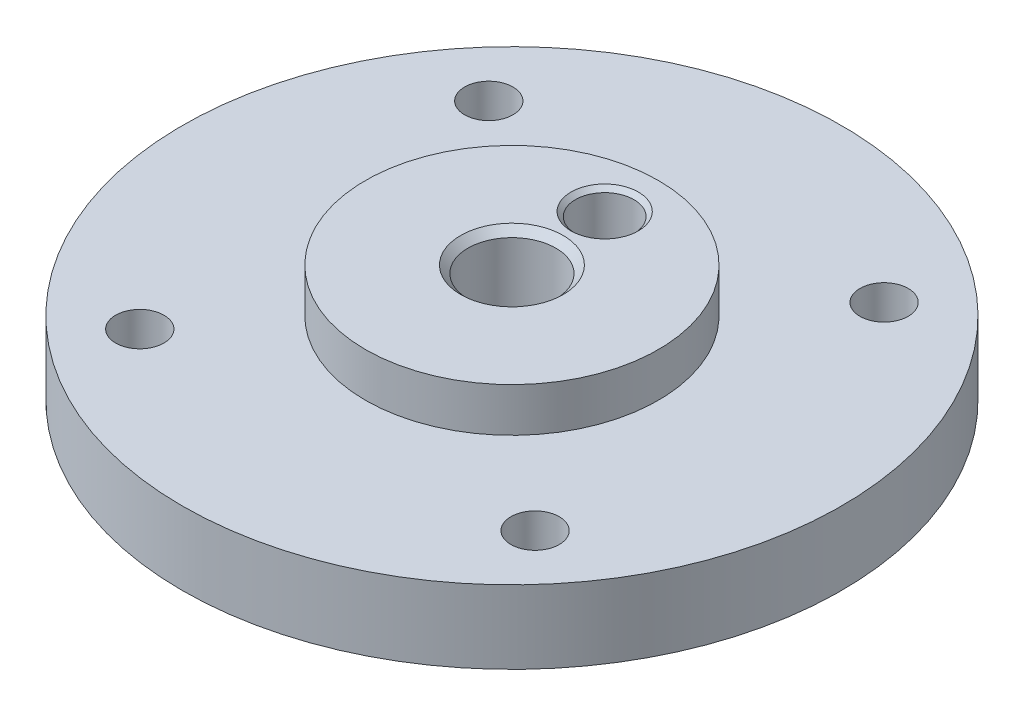
ISO-10303-21;
HEADER;
FILE_DESCRIPTION(('STEP AP214'),'2;1');
FILE_NAME('part.step','',(''),(''),'','','');
FILE_SCHEMA(('AUTOMOTIVE_DESIGN { 1 0 10303 214 1 1 1 1 }'));
ENDSEC;
DATA;
#1=APPLICATION_CONTEXT('core data for automotive mechanical design processes');
#2=APPLICATION_PROTOCOL_DEFINITION('international standard','automotive_design',2000,#1);
#3=PRODUCT_CONTEXT('',#1,'mechanical');
#4=PRODUCT('Part','Part','',(#3));
#5=PRODUCT_RELATED_PRODUCT_CATEGORY('part','',(#4));
#6=PRODUCT_DEFINITION_FORMATION('','',#4);
#7=PRODUCT_DEFINITION_CONTEXT('part definition',#1,'design');
#8=PRODUCT_DEFINITION('design','',#6,#7);
#9=PRODUCT_DEFINITION_SHAPE('','',#8);
#10=(LENGTH_UNIT() NAMED_UNIT(*) SI_UNIT(.MILLI.,.METRE.));
#11=(NAMED_UNIT(*) PLANE_ANGLE_UNIT() SI_UNIT($,.RADIAN.));
#12=(NAMED_UNIT(*) SI_UNIT($,.STERADIAN.) SOLID_ANGLE_UNIT());
#13=UNCERTAINTY_MEASURE_WITH_UNIT(LENGTH_MEASURE(1.E-05),#10,'distance_accuracy_value','');
#14=(GEOMETRIC_REPRESENTATION_CONTEXT(3) GLOBAL_UNCERTAINTY_ASSIGNED_CONTEXT((#13)) GLOBAL_UNIT_ASSIGNED_CONTEXT((#10,
#11,#12)) REPRESENTATION_CONTEXT('',''));
#15=CARTESIAN_POINT('',(0.,0.,0.));
#16=DIRECTION('',(0.,0.,1.));
#17=DIRECTION('',(1.,0.,0.));
#18=AXIS2_PLACEMENT_3D('',#15,#16,#17);
#19=CARTESIAN_POINT('',(0.,0.,0.));
#20=DIRECTION('',(0.,1.,0.));
#21=DIRECTION('',(0.,0.,1.));
#22=AXIS2_PLACEMENT_3D('',#19,#20,#21);
#23=PLANE('',#22);
#24=CARTESIAN_POINT('',(11.9133360356064,0.,-13.4934215269042));
#25=DIRECTION('',(0.,-1.,0.));
#26=DIRECTION('',(0.,0.,-1.));
#27=AXIS2_PLACEMENT_3D('',#24,#25,#26);
#28=CIRCLE('',#27,1.64999999999999);
#29=CARTESIAN_POINT('',(11.9133360356064,0.,-15.1434215269042));
#30=VERTEX_POINT('',#29);
#31=EDGE_CURVE('E138',#30,#30,#28,.T.);
#32=ORIENTED_EDGE('',*,*,#31,.F.);
#33=EDGE_LOOP('',(#32));
#34=FACE_BOUND('',#33,.T.);
#35=CARTESIAN_POINT('',(-11.9133360356064,0.,13.4934215269042));
#36=DIRECTION('',(0.,-1.,0.));
#37=DIRECTION('',(0.,0.,-1.));
#38=AXIS2_PLACEMENT_3D('',#35,#36,#37);
#39=CIRCLE('',#38,1.64999999999999);
#40=CARTESIAN_POINT('',(-11.9133360356064,0.,11.8434215269042));
#41=VERTEX_POINT('',#40);
#42=EDGE_CURVE('E122',#41,#41,#39,.T.);
#43=ORIENTED_EDGE('',*,*,#42,.F.);
#44=EDGE_LOOP('',(#43));
#45=FACE_BOUND('',#44,.T.);
#46=CARTESIAN_POINT('',(-13.4934215269042,0.,-11.9133360356064));
#47=DIRECTION('',(0.,-1.,0.));
#48=DIRECTION('',(0.,0.,-1.));
#49=AXIS2_PLACEMENT_3D('',#46,#47,#48);
#50=CIRCLE('',#49,1.64999999999999);
#51=CARTESIAN_POINT('',(-13.4934215269042,0.,-13.5633360356064));
#52=VERTEX_POINT('',#51);
#53=EDGE_CURVE('E114',#52,#52,#50,.T.);
#54=ORIENTED_EDGE('',*,*,#53,.F.);
#55=EDGE_LOOP('',(#54));
#56=FACE_BOUND('',#55,.T.);
#57=CARTESIAN_POINT('',(0.,0.,0.));
#58=DIRECTION('',(0.,-1.,0.));
#59=DIRECTION('',(0.,0.,-1.));
#60=AXIS2_PLACEMENT_3D('',#57,#58,#59);
#61=CIRCLE('',#60,10.);
#62=CARTESIAN_POINT('',(0.,0.,-10.));
#63=VERTEX_POINT('',#62);
#64=EDGE_CURVE('E96',#63,#63,#61,.T.);
#65=ORIENTED_EDGE('',*,*,#64,.F.);
#66=EDGE_LOOP('',(#65));
#67=FACE_BOUND('',#66,.T.);
#68=CARTESIAN_POINT('',(0.,0.,0.));
#69=DIRECTION('',(0.,1.,0.));
#70=DIRECTION('',(0.,0.,1.));
#71=AXIS2_PLACEMENT_3D('',#68,#69,#70);
#72=CIRCLE('',#71,22.5);
#73=CARTESIAN_POINT('',(0.,0.,22.5));
#74=VERTEX_POINT('',#73);
#75=EDGE_CURVE('E87',#74,#74,#72,.T.);
#76=ORIENTED_EDGE('',*,*,#75,.F.);
#77=EDGE_LOOP('',(#76));
#78=FACE_BOUND('',#77,.T.);
#79=CARTESIAN_POINT('',(13.4934215269042,0.,11.9133360356064));
#80=DIRECTION('',(0.,-1.,0.));
#81=DIRECTION('',(0.,0.,-1.));
#82=AXIS2_PLACEMENT_3D('',#79,#80,#81);
#83=CIRCLE('',#82,1.64999999999999);
#84=CARTESIAN_POINT('',(13.4934215269042,0.,10.2633360356064));
#85=VERTEX_POINT('',#84);
#86=EDGE_CURVE('E130',#85,#85,#83,.T.);
#87=ORIENTED_EDGE('',*,*,#86,.F.);
#88=EDGE_LOOP('',(#87));
#89=FACE_BOUND('',#88,.T.);
#90=ADVANCED_FACE('F53',(#34,#45,#56,#67,#78,#89),#23,.F.);
#91=CARTESIAN_POINT('',(0.,5.,0.));
#92=DIRECTION('',(0.,-1.,0.));
#93=DIRECTION('',(0.,0.,-1.));
#94=AXIS2_PLACEMENT_3D('',#91,#92,#93);
#95=CYLINDRICAL_SURFACE('',#94,22.5);
#96=CARTESIAN_POINT('',(0.,5.,0.));
#97=DIRECTION('',(0.,1.,0.));
#98=DIRECTION('',(0.,0.,1.));
#99=AXIS2_PLACEMENT_3D('',#96,#97,#98);
#100=CIRCLE('',#99,22.5);
#101=CARTESIAN_POINT('',(0.,5.,22.5));
#102=VERTEX_POINT('',#101);
#103=EDGE_CURVE('E91',#102,#102,#100,.T.);
#104=ORIENTED_EDGE('',*,*,#103,.F.);
#105=EDGE_LOOP('',(#104));
#106=FACE_BOUND('',#105,.T.);
#107=ORIENTED_EDGE('',*,*,#75,.T.);
#108=EDGE_LOOP('',(#107));
#109=FACE_BOUND('',#108,.T.);
#110=ADVANCED_FACE('F168',(#106,#109),#95,.T.);
#111=CARTESIAN_POINT('',(0.,5.,0.));
#112=DIRECTION('',(0.,1.,0.));
#113=DIRECTION('',(0.,0.,1.));
#114=AXIS2_PLACEMENT_3D('',#111,#112,#113);
#115=PLANE('',#114);
#116=CARTESIAN_POINT('',(11.9133360356064,5.,-13.4934215269042));
#117=DIRECTION('',(0.,1.,0.));
#118=DIRECTION('',(0.,0.,1.));
#119=AXIS2_PLACEMENT_3D('',#116,#117,#118);
#120=CIRCLE('',#119,1.64999999999999);
#121=CARTESIAN_POINT('',(11.9133360356064,5.,-11.8434215269042));
#122=VERTEX_POINT('',#121);
#123=EDGE_CURVE('E134',#122,#122,#120,.T.);
#124=ORIENTED_EDGE('',*,*,#123,.F.);
#125=EDGE_LOOP('',(#124));
#126=FACE_BOUND('',#125,.T.);
#127=CARTESIAN_POINT('',(13.4934215269042,5.,11.9133360356064));
#128=DIRECTION('',(0.,1.,0.));
#129=DIRECTION('',(0.,0.,1.));
#130=AXIS2_PLACEMENT_3D('',#127,#128,#129);
#131=CIRCLE('',#130,1.64999999999999);
#132=CARTESIAN_POINT('',(13.4934215269042,5.,13.5633360356064));
#133=VERTEX_POINT('',#132);
#134=EDGE_CURVE('E126',#133,#133,#131,.T.);
#135=ORIENTED_EDGE('',*,*,#134,.F.);
#136=EDGE_LOOP('',(#135));
#137=FACE_BOUND('',#136,.T.);
#138=CARTESIAN_POINT('',(-11.9133360356064,5.,13.4934215269042));
#139=DIRECTION('',(0.,1.,0.));
#140=DIRECTION('',(0.,0.,1.));
#141=AXIS2_PLACEMENT_3D('',#138,#139,#140);
#142=CIRCLE('',#141,1.64999999999999);
#143=CARTESIAN_POINT('',(-11.9133360356064,5.,15.1434215269042));
#144=VERTEX_POINT('',#143);
#145=EDGE_CURVE('E118',#144,#144,#142,.T.);
#146=ORIENTED_EDGE('',*,*,#145,.F.);
#147=EDGE_LOOP('',(#146));
#148=FACE_BOUND('',#147,.T.);
#149=CARTESIAN_POINT('',(-13.4934215269042,5.,-11.9133360356064));
#150=DIRECTION('',(0.,1.,0.));
#151=DIRECTION('',(0.,0.,1.));
#152=AXIS2_PLACEMENT_3D('',#149,#150,#151);
#153=CIRCLE('',#152,1.64999999999999);
#154=CARTESIAN_POINT('',(-13.4934215269042,5.,-10.2633360356064));
#155=VERTEX_POINT('',#154);
#156=EDGE_CURVE('E110',#155,#155,#153,.T.);
#157=ORIENTED_EDGE('',*,*,#156,.F.);
#158=EDGE_LOOP('',(#157));
#159=FACE_BOUND('',#158,.T.);
#160=CARTESIAN_POINT('',(0.,5.,0.));
#161=DIRECTION('',(0.,1.,0.));
#162=DIRECTION('',(0.,0.,1.));
#163=AXIS2_PLACEMENT_3D('',#160,#161,#162);
#164=CIRCLE('',#163,10.);
#165=CARTESIAN_POINT('',(0.,5.,10.));
#166=VERTEX_POINT('',#165);
#167=EDGE_CURVE('E86',#166,#166,#164,.T.);
#168=ORIENTED_EDGE('',*,*,#167,.F.);
#169=EDGE_LOOP('',(#168));
#170=FACE_BOUND('',#169,.T.);
#171=ORIENTED_EDGE('',*,*,#103,.T.);
#172=EDGE_LOOP('',(#171));
#173=FACE_BOUND('',#172,.T.);
#174=ADVANCED_FACE('F176',(#126,#137,#148,#159,#170,#173),#115,.T.);
#175=CARTESIAN_POINT('',(0.,-5.,0.));
#176=DIRECTION('',(0.,1.,0.));
#177=DIRECTION('',(0.,0.,1.));
#178=AXIS2_PLACEMENT_3D('',#175,#176,#177);
#179=CYLINDRICAL_SURFACE('',#178,10.);
#180=CARTESIAN_POINT('',(0.,-5.,0.));
#181=DIRECTION('',(0.,-1.,0.));
#182=DIRECTION('',(0.,0.,-1.));
#183=AXIS2_PLACEMENT_3D('',#180,#181,#182);
#184=CIRCLE('',#183,10.);
#185=CARTESIAN_POINT('',(0.,-5.,-10.));
#186=VERTEX_POINT('',#185);
#187=EDGE_CURVE('E92',#186,#186,#184,.T.);
#188=ORIENTED_EDGE('',*,*,#187,.F.);
#189=EDGE_LOOP('',(#188));
#190=FACE_BOUND('',#189,.T.);
#191=ORIENTED_EDGE('',*,*,#64,.T.);
#192=EDGE_LOOP('',(#191));
#193=FACE_BOUND('',#192,.T.);
#194=ADVANCED_FACE('F217',(#190,#193),#179,.T.);
#195=CARTESIAN_POINT('',(0.,-5.,0.));
#196=DIRECTION('',(0.,-1.,0.));
#197=DIRECTION('',(0.,0.,-1.));
#198=AXIS2_PLACEMENT_3D('',#195,#196,#197);
#199=PLANE('',#198);
#200=CARTESIAN_POINT('',(0.,-5.,0.));
#201=DIRECTION('',(0.,-1.,0.));
#202=DIRECTION('',(0.,0.,-1.));
#203=AXIS2_PLACEMENT_3D('',#200,#201,#202);
#204=CIRCLE('',#203,3.5);
#205=CARTESIAN_POINT('',(0.,-5.,-3.5));
#206=VERTEX_POINT('',#205);
#207=EDGE_CURVE('E82',#206,#206,#204,.F.);
#208=ORIENTED_EDGE('',*,*,#207,.T.);
#209=EDGE_LOOP('',(#208));
#210=FACE_BOUND('',#209,.T.);
#211=CARTESIAN_POINT('',(0.,-5.,-6.33221982249146));
#212=DIRECTION('',(0.,1.,0.));
#213=DIRECTION('',(0.,0.,1.));
#214=AXIS2_PLACEMENT_3D('',#211,#212,#213);
#215=CIRCLE('',#214,2.);
#216=CARTESIAN_POINT('',(0.,-5.,-4.33221982249146));
#217=VERTEX_POINT('',#216);
#218=EDGE_CURVE('E142',#217,#217,#215,.T.);
#219=ORIENTED_EDGE('',*,*,#218,.T.);
#220=EDGE_LOOP('',(#219));
#221=FACE_BOUND('',#220,.T.);
#222=ORIENTED_EDGE('',*,*,#187,.T.);
#223=EDGE_LOOP('',(#222));
#224=FACE_BOUND('',#223,.T.);
#225=ADVANCED_FACE('F147',(#210,#221,#224),#199,.T.);
#226=CARTESIAN_POINT('',(0.,8.,0.));
#227=DIRECTION('',(0.,-1.,0.));
#228=DIRECTION('',(0.,0.,-1.));
#229=AXIS2_PLACEMENT_3D('',#226,#227,#228);
#230=CYLINDRICAL_SURFACE('',#229,10.);
#231=CARTESIAN_POINT('',(0.,8.,0.));
#232=DIRECTION('',(0.,1.,0.));
#233=DIRECTION('',(0.,0.,1.));
#234=AXIS2_PLACEMENT_3D('',#231,#232,#233);
#235=CIRCLE('',#234,10.);
#236=CARTESIAN_POINT('',(0.,8.,10.));
#237=VERTEX_POINT('',#236);
#238=EDGE_CURVE('E103',#237,#237,#235,.T.);
#239=ORIENTED_EDGE('',*,*,#238,.F.);
#240=EDGE_LOOP('',(#239));
#241=FACE_BOUND('',#240,.T.);
#242=ORIENTED_EDGE('',*,*,#167,.T.);
#243=EDGE_LOOP('',(#242));
#244=FACE_BOUND('',#243,.T.);
#245=ADVANCED_FACE('F211',(#241,#244),#230,.T.);
#246=CARTESIAN_POINT('',(0.,8.,0.));
#247=DIRECTION('',(0.,1.,0.));
#248=DIRECTION('',(0.,0.,1.));
#249=AXIS2_PLACEMENT_3D('',#246,#247,#248);
#250=PLANE('',#249);
#251=CARTESIAN_POINT('',(0.,8.,-6.33221982249146));
#252=DIRECTION('',(0.,1.,0.));
#253=DIRECTION('',(0.,0.,1.));
#254=AXIS2_PLACEMENT_3D('',#251,#252,#253);
#255=CIRCLE('',#254,2.30000000000002);
#256=CARTESIAN_POINT('',(0.,8.,-4.03221982249145));
#257=VERTEX_POINT('',#256);
#258=EDGE_CURVE('E10',#257,#257,#255,.F.);
#259=ORIENTED_EDGE('',*,*,#258,.T.);
#260=EDGE_LOOP('',(#259));
#261=FACE_BOUND('',#260,.T.);
#262=CARTESIAN_POINT('',(0.,8.,0.));
#263=DIRECTION('',(0.,1.,0.));
#264=DIRECTION('',(0.,0.,1.));
#265=AXIS2_PLACEMENT_3D('',#262,#263,#264);
#266=CIRCLE('',#265,3.49999999999999);
#267=CARTESIAN_POINT('',(0.,8.,3.49999999999999));
#268=VERTEX_POINT('',#267);
#269=EDGE_CURVE('E67',#268,#268,#266,.F.);
#270=ORIENTED_EDGE('',*,*,#269,.T.);
#271=EDGE_LOOP('',(#270));
#272=FACE_BOUND('',#271,.T.);
#273=ORIENTED_EDGE('',*,*,#238,.T.);
#274=EDGE_LOOP('',(#273));
#275=FACE_BOUND('',#274,.T.);
#276=ADVANCED_FACE('F201',(#261,#272,#275),#250,.T.);
#277=CARTESIAN_POINT('',(0.,-5.,0.));
#278=DIRECTION('',(0.,1.,0.));
#279=DIRECTION('',(0.,0.,1.));
#280=AXIS2_PLACEMENT_3D('',#277,#278,#279);
#281=CYLINDRICAL_SURFACE('',#280,3.);
#282=CARTESIAN_POINT('',(0.,-4.49999999999999,0.));
#283=DIRECTION('',(0.,-1.,0.));
#284=DIRECTION('',(0.,0.,-1.));
#285=AXIS2_PLACEMENT_3D('',#282,#283,#284);
#286=CIRCLE('',#285,3.);
#287=CARTESIAN_POINT('',(0.,-4.49999999999999,-3.));
#288=VERTEX_POINT('',#287);
#289=EDGE_CURVE('E72',#288,#288,#286,.T.);
#290=ORIENTED_EDGE('',*,*,#289,.T.);
#291=EDGE_LOOP('',(#290));
#292=FACE_BOUND('',#291,.T.);
#293=CARTESIAN_POINT('',(0.,7.50000000000001,0.));
#294=DIRECTION('',(0.,1.,0.));
#295=DIRECTION('',(0.,0.,1.));
#296=AXIS2_PLACEMENT_3D('',#293,#294,#295);
#297=CIRCLE('',#296,3.);
#298=CARTESIAN_POINT('',(0.,7.50000000000001,3.));
#299=VERTEX_POINT('',#298);
#300=EDGE_CURVE('E78',#299,#299,#297,.T.);
#301=ORIENTED_EDGE('',*,*,#300,.T.);
#302=EDGE_LOOP('',(#301));
#303=FACE_BOUND('',#302,.T.);
#304=ADVANCED_FACE('F198',(#292,#303),#281,.F.);
#305=CARTESIAN_POINT('',(-13.4934215269042,0.,-11.9133360356064));
#306=DIRECTION('',(0.,-1.,0.));
#307=DIRECTION('',(0.,0.,-1.));
#308=AXIS2_PLACEMENT_3D('',#305,#306,#307);
#309=CYLINDRICAL_SURFACE('',#308,1.64999999999999);
#310=ORIENTED_EDGE('',*,*,#156,.T.);
#311=EDGE_LOOP('',(#310));
#312=FACE_BOUND('',#311,.T.);
#313=ORIENTED_EDGE('',*,*,#53,.T.);
#314=EDGE_LOOP('',(#313));
#315=FACE_BOUND('',#314,.T.);
#316=ADVANCED_FACE('F200',(#312,#315),#309,.F.);
#317=CARTESIAN_POINT('',(-11.9133360356064,0.,13.4934215269042));
#318=DIRECTION('',(0.,-1.,0.));
#319=DIRECTION('',(0.,0.,-1.));
#320=AXIS2_PLACEMENT_3D('',#317,#318,#319);
#321=CYLINDRICAL_SURFACE('',#320,1.64999999999999);
#322=ORIENTED_EDGE('',*,*,#145,.T.);
#323=EDGE_LOOP('',(#322));
#324=FACE_BOUND('',#323,.T.);
#325=ORIENTED_EDGE('',*,*,#42,.T.);
#326=EDGE_LOOP('',(#325));
#327=FACE_BOUND('',#326,.T.);
#328=ADVANCED_FACE('F208',(#324,#327),#321,.F.);
#329=CARTESIAN_POINT('',(13.4934215269042,0.,11.9133360356064));
#330=DIRECTION('',(0.,-1.,0.));
#331=DIRECTION('',(0.,0.,-1.));
#332=AXIS2_PLACEMENT_3D('',#329,#330,#331);
#333=CYLINDRICAL_SURFACE('',#332,1.64999999999999);
#334=ORIENTED_EDGE('',*,*,#134,.T.);
#335=EDGE_LOOP('',(#334));
#336=FACE_BOUND('',#335,.T.);
#337=ORIENTED_EDGE('',*,*,#86,.T.);
#338=EDGE_LOOP('',(#337));
#339=FACE_BOUND('',#338,.T.);
#340=ADVANCED_FACE('F164',(#336,#339),#333,.F.);
#341=CARTESIAN_POINT('',(11.9133360356064,0.,-13.4934215269042));
#342=DIRECTION('',(0.,-1.,0.));
#343=DIRECTION('',(0.,0.,-1.));
#344=AXIS2_PLACEMENT_3D('',#341,#342,#343);
#345=CYLINDRICAL_SURFACE('',#344,1.64999999999999);
#346=ORIENTED_EDGE('',*,*,#123,.T.);
#347=EDGE_LOOP('',(#346));
#348=FACE_BOUND('',#347,.T.);
#349=ORIENTED_EDGE('',*,*,#31,.T.);
#350=EDGE_LOOP('',(#349));
#351=FACE_BOUND('',#350,.T.);
#352=ADVANCED_FACE('F153',(#348,#351),#345,.F.);
#353=CARTESIAN_POINT('',(0.,-5.,-6.33221982249146));
#354=DIRECTION('',(0.,1.,0.));
#355=DIRECTION('',(0.,0.,1.));
#356=AXIS2_PLACEMENT_3D('',#353,#354,#355);
#357=CYLINDRICAL_SURFACE('',#356,2.);
#358=CARTESIAN_POINT('',(0.,7.69999999999999,-6.33221982249146));
#359=DIRECTION('',(0.,1.,0.));
#360=DIRECTION('',(0.,0.,1.));
#361=AXIS2_PLACEMENT_3D('',#358,#359,#360);
#362=CIRCLE('',#361,2.);
#363=CARTESIAN_POINT('',(0.,7.69999999999999,-4.33221982249146));
#364=VERTEX_POINT('',#363);
#365=EDGE_CURVE('E62',#364,#364,#362,.T.);
#366=ORIENTED_EDGE('',*,*,#365,.T.);
#367=EDGE_LOOP('',(#366));
#368=FACE_BOUND('',#367,.T.);
#369=ORIENTED_EDGE('',*,*,#218,.F.);
#370=EDGE_LOOP('',(#369));
#371=FACE_BOUND('',#370,.T.);
#372=ADVANCED_FACE('F150',(#368,#371),#357,.F.);
#373=CARTESIAN_POINT('',(0.,-5.,0.));
#374=DIRECTION('',(0.,-1.,0.));
#375=DIRECTION('',(0.,0.,-1.));
#376=AXIS2_PLACEMENT_3D('',#373,#374,#375);
#377=CONICAL_SURFACE('',#376,3.5,0.785398163397438);
#378=ORIENTED_EDGE('',*,*,#289,.F.);
#379=EDGE_LOOP('',(#378));
#380=FACE_BOUND('',#379,.T.);
#381=ORIENTED_EDGE('',*,*,#207,.F.);
#382=EDGE_LOOP('',(#381));
#383=FACE_BOUND('',#382,.T.);
#384=ADVANCED_FACE('F152',(#380,#383),#377,.F.);
#385=CARTESIAN_POINT('',(0.,7.50000000000001,0.));
#386=DIRECTION('',(0.,1.,0.));
#387=DIRECTION('',(0.,0.,1.));
#388=AXIS2_PLACEMENT_3D('',#385,#386,#387);
#389=CONICAL_SURFACE('',#388,3.,0.785398163397444);
#390=ORIENTED_EDGE('',*,*,#269,.F.);
#391=EDGE_LOOP('',(#390));
#392=FACE_BOUND('',#391,.T.);
#393=ORIENTED_EDGE('',*,*,#300,.F.);
#394=EDGE_LOOP('',(#393));
#395=FACE_BOUND('',#394,.T.);
#396=ADVANCED_FACE('F160',(#392,#395),#389,.F.);
#397=CARTESIAN_POINT('',(0.,7.69999999999999,-6.33221982249146));
#398=DIRECTION('',(0.,1.,0.));
#399=DIRECTION('',(0.,0.,1.));
#400=AXIS2_PLACEMENT_3D('',#397,#398,#399);
#401=CONICAL_SURFACE('',#400,2.,0.785398163397455);
#402=ORIENTED_EDGE('',*,*,#258,.F.);
#403=EDGE_LOOP('',(#402));
#404=FACE_BOUND('',#403,.T.);
#405=ORIENTED_EDGE('',*,*,#365,.F.);
#406=EDGE_LOOP('',(#405));
#407=FACE_BOUND('',#406,.T.);
#408=ADVANCED_FACE('F56',(#404,#407),#401,.F.);
#409=CLOSED_SHELL('',(#90,#110,#174,#194,#225,#245,#276,#304,#316,#328,#340,#352,#372,#384,#396,#408));
#410=MANIFOLD_SOLID_BREP('B2',#409);
#411=ADVANCED_BREP_SHAPE_REPRESENTATION('',(#18,#410),#14);
#412=SHAPE_DEFINITION_REPRESENTATION(#9,#411);
ENDSEC;
END-ISO-10303-21;
